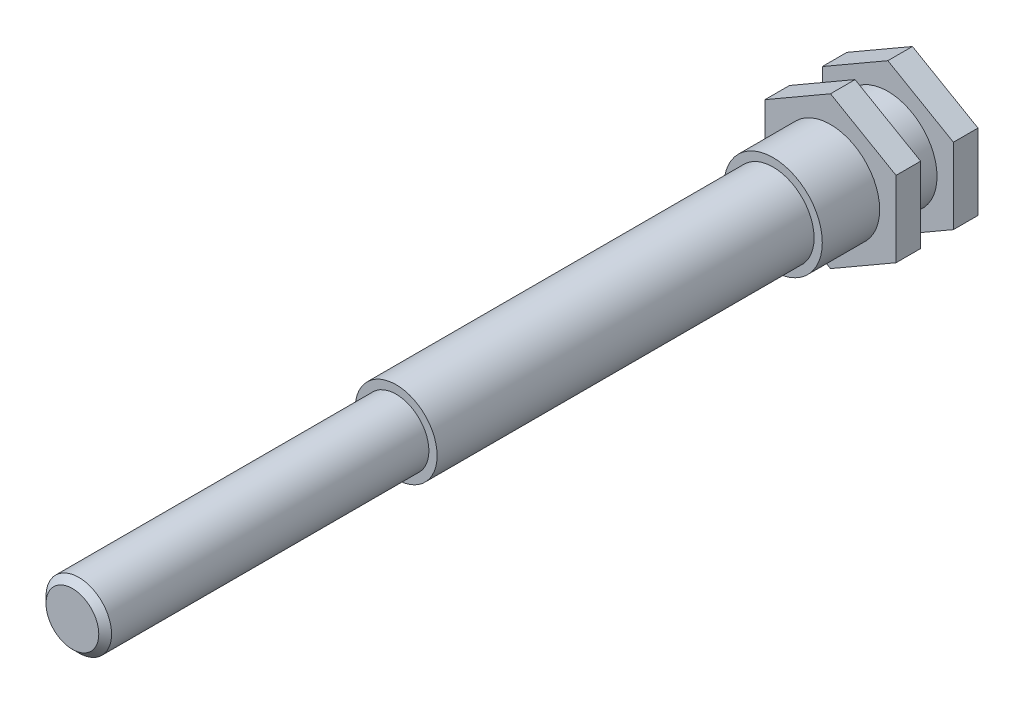
ISO-10303-21;
HEADER;
FILE_DESCRIPTION(('STEP AP214'),'2;1');
FILE_NAME('part.step','',(''),(''),'','','');
FILE_SCHEMA(('AUTOMOTIVE_DESIGN { 1 0 10303 214 1 1 1 1 }'));
ENDSEC;
DATA;
#1=APPLICATION_CONTEXT('core data for automotive mechanical design processes');
#2=APPLICATION_PROTOCOL_DEFINITION('international standard','automotive_design',2000,#1);
#3=PRODUCT_CONTEXT('',#1,'mechanical');
#4=PRODUCT('Part','Part','',(#3));
#5=PRODUCT_RELATED_PRODUCT_CATEGORY('part','',(#4));
#6=PRODUCT_DEFINITION_FORMATION('','',#4);
#7=PRODUCT_DEFINITION_CONTEXT('part definition',#1,'design');
#8=PRODUCT_DEFINITION('design','',#6,#7);
#9=PRODUCT_DEFINITION_SHAPE('','',#8);
#10=(LENGTH_UNIT() NAMED_UNIT(*) SI_UNIT(.MILLI.,.METRE.));
#11=(NAMED_UNIT(*) PLANE_ANGLE_UNIT() SI_UNIT($,.RADIAN.));
#12=(NAMED_UNIT(*) SI_UNIT($,.STERADIAN.) SOLID_ANGLE_UNIT());
#13=UNCERTAINTY_MEASURE_WITH_UNIT(LENGTH_MEASURE(1.E-05),#10,'distance_accuracy_value','');
#14=(GEOMETRIC_REPRESENTATION_CONTEXT(3) GLOBAL_UNCERTAINTY_ASSIGNED_CONTEXT((#13)) GLOBAL_UNIT_ASSIGNED_CONTEXT((#10,
#11,#12)) REPRESENTATION_CONTEXT('',''));
#15=CARTESIAN_POINT('',(0.,0.,0.));
#16=DIRECTION('',(0.,0.,1.));
#17=DIRECTION('',(1.,0.,0.));
#18=AXIS2_PLACEMENT_3D('',#15,#16,#17);
#19=CARTESIAN_POINT('',(0.,0.,31.5));
#20=DIRECTION('',(0.,0.,1.));
#21=DIRECTION('',(1.,0.,0.));
#22=AXIS2_PLACEMENT_3D('',#19,#20,#21);
#23=PLANE('',#22);
#24=CARTESIAN_POINT('',(0.,0.,31.5));
#25=DIRECTION('',(0.,0.,1.));
#26=DIRECTION('',(1.,0.,0.));
#27=AXIS2_PLACEMENT_3D('',#24,#25,#26);
#28=CIRCLE('',#27,2.5);
#29=CARTESIAN_POINT('',(2.5,0.,31.5));
#30=VERTEX_POINT('',#29);
#31=EDGE_CURVE('E306',#30,#30,#28,.T.);
#32=ORIENTED_EDGE('',*,*,#31,.T.);
#33=EDGE_LOOP('',(#32));
#34=FACE_BOUND('',#33,.T.);
#35=CARTESIAN_POINT('',(0.,0.,31.5));
#36=DIRECTION('',(0.,0.,1.));
#37=DIRECTION('',(1.,0.,0.));
#38=AXIS2_PLACEMENT_3D('',#35,#36,#37);
#39=CIRCLE('',#38,2.);
#40=CARTESIAN_POINT('',(2.,0.,31.5));
#41=VERTEX_POINT('',#40);
#42=EDGE_CURVE('E326',#41,#41,#39,.T.);
#43=ORIENTED_EDGE('',*,*,#42,.F.);
#44=EDGE_LOOP('',(#43));
#45=FACE_BOUND('',#44,.T.);
#46=ADVANCED_FACE('F49',(#34,#45),#23,.T.);
#47=CARTESIAN_POINT('',(0.,0.,8.5));
#48=DIRECTION('',(0.,0.,1.));
#49=DIRECTION('',(1.,0.,0.));
#50=AXIS2_PLACEMENT_3D('',#47,#48,#49);
#51=PLANE('',#50);
#52=CARTESIAN_POINT('',(0.,0.,8.5));
#53=DIRECTION('',(0.,0.,1.));
#54=DIRECTION('',(1.,0.,0.));
#55=AXIS2_PLACEMENT_3D('',#52,#53,#54);
#56=CIRCLE('',#55,3.);
#57=CARTESIAN_POINT('',(3.,0.,8.5));
#58=VERTEX_POINT('',#57);
#59=EDGE_CURVE('E144',#58,#58,#56,.T.);
#60=ORIENTED_EDGE('',*,*,#59,.T.);
#61=EDGE_LOOP('',(#60));
#62=FACE_BOUND('',#61,.T.);
#63=CARTESIAN_POINT('',(0.,0.,8.5));
#64=DIRECTION('',(0.,0.,1.));
#65=DIRECTION('',(1.,0.,0.));
#66=AXIS2_PLACEMENT_3D('',#63,#64,#65);
#67=CIRCLE('',#66,2.5);
#68=CARTESIAN_POINT('',(2.5,0.,8.5));
#69=VERTEX_POINT('',#68);
#70=EDGE_CURVE('E323',#69,#69,#67,.T.);
#71=ORIENTED_EDGE('',*,*,#70,.F.);
#72=EDGE_LOOP('',(#71));
#73=FACE_BOUND('',#72,.T.);
#74=ADVANCED_FACE('F181',(#62,#73),#51,.T.);
#75=CARTESIAN_POINT('',(0.,0.,8.5));
#76=DIRECTION('',(0.,0.,-1.));
#77=DIRECTION('',(-1.,0.,0.));
#78=AXIS2_PLACEMENT_3D('',#75,#76,#77);
#79=CYLINDRICAL_SURFACE('',#78,3.);
#80=CARTESIAN_POINT('',(0.,0.,1.5));
#81=DIRECTION('',(0.,0.,1.));
#82=DIRECTION('',(1.,0.,0.));
#83=AXIS2_PLACEMENT_3D('',#80,#81,#82);
#84=CIRCLE('',#83,3.);
#85=CARTESIAN_POINT('',(3.,0.,1.5));
#86=VERTEX_POINT('',#85);
#87=EDGE_CURVE('E165',#86,#86,#84,.T.);
#88=ORIENTED_EDGE('',*,*,#87,.T.);
#89=EDGE_LOOP('',(#88));
#90=FACE_BOUND('',#89,.T.);
#91=CARTESIAN_POINT('',(0.,0.,3.5));
#92=DIRECTION('',(0.,0.,1.));
#93=DIRECTION('',(1.,0.,0.));
#94=AXIS2_PLACEMENT_3D('',#91,#92,#93);
#95=CIRCLE('',#94,3.);
#96=CARTESIAN_POINT('',(3.,0.,3.5));
#97=VERTEX_POINT('',#96);
#98=EDGE_CURVE('E160',#97,#97,#95,.T.);
#99=ORIENTED_EDGE('',*,*,#98,.F.);
#100=EDGE_LOOP('',(#99));
#101=FACE_BOUND('',#100,.T.);
#102=ADVANCED_FACE('F187',(#90,#101),#79,.T.);
#103=CARTESIAN_POINT('',(0.,0.,1.5));
#104=DIRECTION('',(0.,0.,1.));
#105=DIRECTION('',(1.,0.,0.));
#106=AXIS2_PLACEMENT_3D('',#103,#104,#105);
#107=PLANE('',#106);
#108=DIRECTION('',(-0.86602540378444,-0.500000000000001,0.));
#109=VECTOR('',#108,1.);
#110=CARTESIAN_POINT('',(0.,4.61880215351702,1.5));
#111=LINE('',#110,#109);
#112=CARTESIAN_POINT('',(0.,4.61880215351702,1.5));
#113=VERTEX_POINT('',#112);
#114=CARTESIAN_POINT('',(-4.,2.3094010767585,1.5));
#115=VERTEX_POINT('',#114);
#116=EDGE_CURVE('E151',#113,#115,#111,.T.);
#117=ORIENTED_EDGE('',*,*,#116,.T.);
#118=DIRECTION('',(0.,-1.,0.));
#119=VECTOR('',#118,1.);
#120=CARTESIAN_POINT('',(-4.,2.3094010767585,1.5));
#121=LINE('',#120,#119);
#122=CARTESIAN_POINT('',(-4.00000000000001,-2.30940107675851,1.5));
#123=VERTEX_POINT('',#122);
#124=EDGE_CURVE('E105',#115,#123,#121,.T.);
#125=ORIENTED_EDGE('',*,*,#124,.T.);
#126=DIRECTION('',(0.86602540378444,-0.5,0.));
#127=VECTOR('',#126,1.);
#128=CARTESIAN_POINT('',(-4.00000000000001,-2.30940107675851,1.5));
#129=LINE('',#128,#127);
#130=CARTESIAN_POINT('',(0.,-4.61880215351701,1.5));
#131=VERTEX_POINT('',#130);
#132=EDGE_CURVE('E122',#123,#131,#129,.T.);
#133=ORIENTED_EDGE('',*,*,#132,.T.);
#134=DIRECTION('',(0.86602540378444,0.500000000000001,0.));
#135=VECTOR('',#134,1.);
#136=CARTESIAN_POINT('',(0.,-4.61880215351701,1.5));
#137=LINE('',#136,#135);
#138=CARTESIAN_POINT('',(4.,-2.30940107675851,1.5));
#139=VERTEX_POINT('',#138);
#140=EDGE_CURVE('E115',#131,#139,#137,.T.);
#141=ORIENTED_EDGE('',*,*,#140,.T.);
#142=DIRECTION('',(0.,1.,0.));
#143=VECTOR('',#142,1.);
#144=CARTESIAN_POINT('',(4.,-2.30940107675851,1.5));
#145=LINE('',#144,#143);
#146=CARTESIAN_POINT('',(4.,2.3094010767585,1.5));
#147=VERTEX_POINT('',#146);
#148=EDGE_CURVE('E120',#139,#147,#145,.T.);
#149=ORIENTED_EDGE('',*,*,#148,.T.);
#150=DIRECTION('',(-0.86602540378444,0.5,0.));
#151=VECTOR('',#150,1.);
#152=CARTESIAN_POINT('',(4.,2.3094010767585,1.5));
#153=LINE('',#152,#151);
#154=EDGE_CURVE('E66',#147,#113,#153,.T.);
#155=ORIENTED_EDGE('',*,*,#154,.T.);
#156=EDGE_LOOP('',(#117,#125,#133,#141,#149,#155));
#157=FACE_BOUND('',#156,.T.);
#158=ORIENTED_EDGE('',*,*,#87,.F.);
#159=EDGE_LOOP('',(#158));
#160=FACE_BOUND('',#159,.T.);
#161=ADVANCED_FACE('F117',(#157,#160),#107,.T.);
#162=CARTESIAN_POINT('',(0.,4.61880215351702,1.5));
#163=DIRECTION('',(0.500000000000001,-0.866025403784439,0.));
#164=DIRECTION('',(0.866025403784439,0.500000000000001,0.));
#165=AXIS2_PLACEMENT_3D('',#162,#163,#164);
#166=PLANE('',#165);
#167=DIRECTION('',(-0.86602540378444,-0.500000000000001,0.));
#168=VECTOR('',#167,1.);
#169=CARTESIAN_POINT('',(0.,4.61880215351702,0.));
#170=LINE('',#169,#168);
#171=CARTESIAN_POINT('',(0.,4.61880215351702,0.));
#172=VERTEX_POINT('',#171);
#173=CARTESIAN_POINT('',(-4.,2.3094010767585,0.));
#174=VERTEX_POINT('',#173);
#175=EDGE_CURVE('E140',#172,#174,#170,.T.);
#176=ORIENTED_EDGE('',*,*,#175,.T.);
#177=DIRECTION('',(0.,0.,-1.));
#178=VECTOR('',#177,1.);
#179=CARTESIAN_POINT('',(-4.,2.3094010767585,1.5));
#180=LINE('',#179,#178);
#181=EDGE_CURVE('E158',#115,#174,#180,.T.);
#182=ORIENTED_EDGE('',*,*,#181,.F.);
#183=ORIENTED_EDGE('',*,*,#116,.F.);
#184=DIRECTION('',(0.,0.,-1.));
#185=VECTOR('',#184,1.);
#186=CARTESIAN_POINT('',(0.,4.61880215351702,1.5));
#187=LINE('',#186,#185);
#188=EDGE_CURVE('E136',#113,#172,#187,.T.);
#189=ORIENTED_EDGE('',*,*,#188,.T.);
#190=EDGE_LOOP('',(#176,#182,#183,#189));
#191=FACE_BOUND('',#190,.T.);
#192=ADVANCED_FACE('F237',(#191),#166,.F.);
#193=CARTESIAN_POINT('',(-4.,2.3094010767585,1.5));
#194=DIRECTION('',(1.,0.,0.));
#195=DIRECTION('',(0.,0.,-1.));
#196=AXIS2_PLACEMENT_3D('',#193,#194,#195);
#197=PLANE('',#196);
#198=DIRECTION('',(0.,-1.,0.));
#199=VECTOR('',#198,1.);
#200=CARTESIAN_POINT('',(-4.,2.3094010767585,0.));
#201=LINE('',#200,#199);
#202=CARTESIAN_POINT('',(-4.00000000000001,-2.30940107675851,0.));
#203=VERTEX_POINT('',#202);
#204=EDGE_CURVE('E143',#174,#203,#201,.T.);
#205=ORIENTED_EDGE('',*,*,#204,.T.);
#206=DIRECTION('',(0.,0.,-1.));
#207=VECTOR('',#206,1.);
#208=CARTESIAN_POINT('',(-4.00000000000001,-2.30940107675851,1.5));
#209=LINE('',#208,#207);
#210=EDGE_CURVE('E155',#123,#203,#209,.T.);
#211=ORIENTED_EDGE('',*,*,#210,.F.);
#212=ORIENTED_EDGE('',*,*,#124,.F.);
#213=ORIENTED_EDGE('',*,*,#181,.T.);
#214=EDGE_LOOP('',(#205,#211,#212,#213));
#215=FACE_BOUND('',#214,.T.);
#216=ADVANCED_FACE('F251',(#215),#197,.F.);
#217=CARTESIAN_POINT('',(-4.00000000000001,-2.30940107675851,1.5));
#218=DIRECTION('',(0.5,0.86602540378444,0.));
#219=DIRECTION('',(-0.86602540378444,0.5,0.));
#220=AXIS2_PLACEMENT_3D('',#217,#218,#219);
#221=PLANE('',#220);
#222=DIRECTION('',(0.86602540378444,-0.5,0.));
#223=VECTOR('',#222,1.);
#224=CARTESIAN_POINT('',(-4.00000000000001,-2.30940107675851,0.));
#225=LINE('',#224,#223);
#226=CARTESIAN_POINT('',(0.,-4.61880215351701,0.));
#227=VERTEX_POINT('',#226);
#228=EDGE_CURVE('E146',#203,#227,#225,.T.);
#229=ORIENTED_EDGE('',*,*,#228,.T.);
#230=DIRECTION('',(0.,0.,-1.));
#231=VECTOR('',#230,1.);
#232=CARTESIAN_POINT('',(0.,-4.61880215351701,1.5));
#233=LINE('',#232,#231);
#234=EDGE_CURVE('E131',#131,#227,#233,.T.);
#235=ORIENTED_EDGE('',*,*,#234,.F.);
#236=ORIENTED_EDGE('',*,*,#132,.F.);
#237=ORIENTED_EDGE('',*,*,#210,.T.);
#238=EDGE_LOOP('',(#229,#235,#236,#237));
#239=FACE_BOUND('',#238,.T.);
#240=ADVANCED_FACE('F248',(#239),#221,.F.);
#241=CARTESIAN_POINT('',(0.,-4.61880215351701,1.5));
#242=DIRECTION('',(-0.500000000000001,0.86602540378444,0.));
#243=DIRECTION('',(-0.86602540378444,-0.500000000000001,0.));
#244=AXIS2_PLACEMENT_3D('',#241,#242,#243);
#245=PLANE('',#244);
#246=DIRECTION('',(0.86602540378444,0.500000000000001,0.));
#247=VECTOR('',#246,1.);
#248=CARTESIAN_POINT('',(0.,-4.61880215351701,0.));
#249=LINE('',#248,#247);
#250=CARTESIAN_POINT('',(4.,-2.30940107675851,0.));
#251=VERTEX_POINT('',#250);
#252=EDGE_CURVE('E130',#227,#251,#249,.T.);
#253=ORIENTED_EDGE('',*,*,#252,.T.);
#254=DIRECTION('',(0.,0.,-1.));
#255=VECTOR('',#254,1.);
#256=CARTESIAN_POINT('',(4.,-2.30940107675851,1.5));
#257=LINE('',#256,#255);
#258=EDGE_CURVE('E127',#139,#251,#257,.T.);
#259=ORIENTED_EDGE('',*,*,#258,.F.);
#260=ORIENTED_EDGE('',*,*,#140,.F.);
#261=ORIENTED_EDGE('',*,*,#234,.T.);
#262=EDGE_LOOP('',(#253,#259,#260,#261));
#263=FACE_BOUND('',#262,.T.);
#264=ADVANCED_FACE('F128',(#263),#245,.F.);
#265=CARTESIAN_POINT('',(4.,-2.30940107675851,1.5));
#266=DIRECTION('',(-1.,0.,0.));
#267=DIRECTION('',(0.,-1.,0.));
#268=AXIS2_PLACEMENT_3D('',#265,#266,#267);
#269=PLANE('',#268);
#270=DIRECTION('',(0.,1.,0.));
#271=VECTOR('',#270,1.);
#272=CARTESIAN_POINT('',(4.,-2.30940107675851,0.));
#273=LINE('',#272,#271);
#274=CARTESIAN_POINT('',(4.,2.3094010767585,0.));
#275=VERTEX_POINT('',#274);
#276=EDGE_CURVE('E90',#251,#275,#273,.T.);
#277=ORIENTED_EDGE('',*,*,#276,.T.);
#278=DIRECTION('',(0.,0.,-1.));
#279=VECTOR('',#278,1.);
#280=CARTESIAN_POINT('',(4.,2.3094010767585,1.5));
#281=LINE('',#280,#279);
#282=EDGE_CURVE('E132',#147,#275,#281,.T.);
#283=ORIENTED_EDGE('',*,*,#282,.F.);
#284=ORIENTED_EDGE('',*,*,#148,.F.);
#285=ORIENTED_EDGE('',*,*,#258,.T.);
#286=EDGE_LOOP('',(#277,#283,#284,#285));
#287=FACE_BOUND('',#286,.T.);
#288=ADVANCED_FACE('F134',(#287),#269,.F.);
#289=CARTESIAN_POINT('',(4.,2.3094010767585,1.5));
#290=DIRECTION('',(-0.500000000000001,-0.86602540378444,0.));
#291=DIRECTION('',(0.86602540378444,-0.500000000000001,0.));
#292=AXIS2_PLACEMENT_3D('',#289,#290,#291);
#293=PLANE('',#292);
#294=DIRECTION('',(-0.86602540378444,0.5,0.));
#295=VECTOR('',#294,1.);
#296=CARTESIAN_POINT('',(4.,2.3094010767585,0.));
#297=LINE('',#296,#295);
#298=EDGE_CURVE('E96',#275,#172,#297,.T.);
#299=ORIENTED_EDGE('',*,*,#298,.T.);
#300=ORIENTED_EDGE('',*,*,#188,.F.);
#301=ORIENTED_EDGE('',*,*,#154,.F.);
#302=ORIENTED_EDGE('',*,*,#282,.T.);
#303=EDGE_LOOP('',(#299,#300,#301,#302));
#304=FACE_BOUND('',#303,.T.);
#305=ADVANCED_FACE('F240',(#304),#293,.F.);
#306=CARTESIAN_POINT('',(0.,0.,0.));
#307=DIRECTION('',(0.,0.,1.));
#308=DIRECTION('',(1.,0.,0.));
#309=AXIS2_PLACEMENT_3D('',#306,#307,#308);
#310=PLANE('',#309);
#311=ORIENTED_EDGE('',*,*,#175,.F.);
#312=ORIENTED_EDGE('',*,*,#298,.F.);
#313=ORIENTED_EDGE('',*,*,#276,.F.);
#314=ORIENTED_EDGE('',*,*,#252,.F.);
#315=ORIENTED_EDGE('',*,*,#228,.F.);
#316=ORIENTED_EDGE('',*,*,#204,.F.);
#317=EDGE_LOOP('',(#311,#312,#313,#314,#315,#316));
#318=FACE_BOUND('',#317,.T.);
#319=ADVANCED_FACE('F203',(#318),#310,.F.);
#320=CARTESIAN_POINT('',(0.,0.,5.));
#321=DIRECTION('',(0.,0.,1.));
#322=DIRECTION('',(1.,0.,0.));
#323=AXIS2_PLACEMENT_3D('',#320,#321,#322);
#324=PLANE('',#323);
#325=DIRECTION('',(-0.86602540378444,-0.500000000000001,0.));
#326=VECTOR('',#325,1.);
#327=CARTESIAN_POINT('',(0.,4.61880215351702,5.));
#328=LINE('',#327,#326);
#329=CARTESIAN_POINT('',(0.,4.61880215351702,5.));
#330=VERTEX_POINT('',#329);
#331=CARTESIAN_POINT('',(-4.00000000000001,2.30940107675851,5.));
#332=VERTEX_POINT('',#331);
#333=EDGE_CURVE('E290',#330,#332,#328,.T.);
#334=ORIENTED_EDGE('',*,*,#333,.T.);
#335=DIRECTION('',(0.,-1.,0.));
#336=VECTOR('',#335,1.);
#337=CARTESIAN_POINT('',(-4.00000000000001,2.30940107675851,5.));
#338=LINE('',#337,#336);
#339=CARTESIAN_POINT('',(-4.00000000000001,-2.30940107675851,5.));
#340=VERTEX_POINT('',#339);
#341=EDGE_CURVE('E318',#332,#340,#338,.T.);
#342=ORIENTED_EDGE('',*,*,#341,.T.);
#343=DIRECTION('',(0.86602540378444,-0.5,0.));
#344=VECTOR('',#343,1.);
#345=CARTESIAN_POINT('',(-4.00000000000001,-2.30940107675851,5.));
#346=LINE('',#345,#344);
#347=CARTESIAN_POINT('',(0.,-4.61880215351701,5.));
#348=VERTEX_POINT('',#347);
#349=EDGE_CURVE('E315',#340,#348,#346,.T.);
#350=ORIENTED_EDGE('',*,*,#349,.T.);
#351=DIRECTION('',(0.86602540378444,0.500000000000001,0.));
#352=VECTOR('',#351,1.);
#353=CARTESIAN_POINT('',(0.,-4.61880215351701,5.));
#354=LINE('',#353,#352);
#355=CARTESIAN_POINT('',(4.,-2.3094010767585,5.));
#356=VERTEX_POINT('',#355);
#357=EDGE_CURVE('E312',#348,#356,#354,.T.);
#358=ORIENTED_EDGE('',*,*,#357,.T.);
#359=DIRECTION('',(0.,1.,0.));
#360=VECTOR('',#359,1.);
#361=CARTESIAN_POINT('',(4.,-2.3094010767585,5.));
#362=LINE('',#361,#360);
#363=CARTESIAN_POINT('',(4.,2.3094010767585,5.));
#364=VERTEX_POINT('',#363);
#365=EDGE_CURVE('E309',#356,#364,#362,.T.);
#366=ORIENTED_EDGE('',*,*,#365,.T.);
#367=DIRECTION('',(-0.86602540378444,0.5,0.));
#368=VECTOR('',#367,1.);
#369=CARTESIAN_POINT('',(4.,2.3094010767585,5.));
#370=LINE('',#369,#368);
#371=EDGE_CURVE('E286',#364,#330,#370,.T.);
#372=ORIENTED_EDGE('',*,*,#371,.T.);
#373=EDGE_LOOP('',(#334,#342,#350,#358,#366,#372));
#374=FACE_BOUND('',#373,.T.);
#375=CARTESIAN_POINT('',(0.,0.,5.));
#376=DIRECTION('',(0.,0.,1.));
#377=DIRECTION('',(1.,0.,0.));
#378=AXIS2_PLACEMENT_3D('',#375,#376,#377);
#379=CIRCLE('',#378,3.);
#380=CARTESIAN_POINT('',(3.,0.,5.));
#381=VERTEX_POINT('',#380);
#382=EDGE_CURVE('E163',#381,#381,#379,.T.);
#383=ORIENTED_EDGE('',*,*,#382,.F.);
#384=EDGE_LOOP('',(#383));
#385=FACE_BOUND('',#384,.T.);
#386=ADVANCED_FACE('F199',(#374,#385),#324,.T.);
#387=CARTESIAN_POINT('',(0.,0.,3.5));
#388=DIRECTION('',(0.,0.,1.));
#389=DIRECTION('',(1.,0.,0.));
#390=AXIS2_PLACEMENT_3D('',#387,#388,#389);
#391=PLANE('',#390);
#392=DIRECTION('',(-0.86602540378444,-0.500000000000001,0.));
#393=VECTOR('',#392,1.);
#394=CARTESIAN_POINT('',(0.,4.61880215351702,3.5));
#395=LINE('',#394,#393);
#396=CARTESIAN_POINT('',(0.,4.61880215351702,3.5));
#397=VERTEX_POINT('',#396);
#398=CARTESIAN_POINT('',(-4.00000000000001,2.30940107675851,3.5));
#399=VERTEX_POINT('',#398);
#400=EDGE_CURVE('E303',#397,#399,#395,.T.);
#401=ORIENTED_EDGE('',*,*,#400,.F.);
#402=DIRECTION('',(-0.86602540378444,0.5,0.));
#403=VECTOR('',#402,1.);
#404=CARTESIAN_POINT('',(4.,2.3094010767585,3.5));
#405=LINE('',#404,#403);
#406=CARTESIAN_POINT('',(4.,2.3094010767585,3.5));
#407=VERTEX_POINT('',#406);
#408=EDGE_CURVE('E287',#407,#397,#405,.T.);
#409=ORIENTED_EDGE('',*,*,#408,.F.);
#410=DIRECTION('',(0.,1.,0.));
#411=VECTOR('',#410,1.);
#412=CARTESIAN_POINT('',(4.,-2.3094010767585,3.5));
#413=LINE('',#412,#411);
#414=CARTESIAN_POINT('',(4.,-2.3094010767585,3.5));
#415=VERTEX_POINT('',#414);
#416=EDGE_CURVE('E291',#415,#407,#413,.T.);
#417=ORIENTED_EDGE('',*,*,#416,.F.);
#418=DIRECTION('',(0.86602540378444,0.500000000000001,0.));
#419=VECTOR('',#418,1.);
#420=CARTESIAN_POINT('',(0.,-4.61880215351701,3.5));
#421=LINE('',#420,#419);
#422=CARTESIAN_POINT('',(0.,-4.61880215351701,3.5));
#423=VERTEX_POINT('',#422);
#424=EDGE_CURVE('E294',#423,#415,#421,.T.);
#425=ORIENTED_EDGE('',*,*,#424,.F.);
#426=DIRECTION('',(0.86602540378444,-0.5,0.));
#427=VECTOR('',#426,1.);
#428=CARTESIAN_POINT('',(-4.00000000000001,-2.30940107675851,3.5));
#429=LINE('',#428,#427);
#430=CARTESIAN_POINT('',(-4.00000000000001,-2.30940107675851,3.5));
#431=VERTEX_POINT('',#430);
#432=EDGE_CURVE('E297',#431,#423,#429,.T.);
#433=ORIENTED_EDGE('',*,*,#432,.F.);
#434=DIRECTION('',(0.,-1.,0.));
#435=VECTOR('',#434,1.);
#436=CARTESIAN_POINT('',(-4.00000000000001,2.30940107675851,3.5));
#437=LINE('',#436,#435);
#438=EDGE_CURVE('E300',#399,#431,#437,.T.);
#439=ORIENTED_EDGE('',*,*,#438,.F.);
#440=EDGE_LOOP('',(#401,#409,#417,#425,#433,#439));
#441=FACE_BOUND('',#440,.T.);
#442=ORIENTED_EDGE('',*,*,#98,.T.);
#443=EDGE_LOOP('',(#442));
#444=FACE_BOUND('',#443,.T.);
#445=ADVANCED_FACE('F202',(#441,#444),#391,.F.);
#446=CARTESIAN_POINT('',(0.,4.61880215351702,5.));
#447=DIRECTION('',(0.500000000000001,-0.866025403784439,0.));
#448=DIRECTION('',(0.866025403784439,0.500000000000001,0.));
#449=AXIS2_PLACEMENT_3D('',#446,#447,#448);
#450=PLANE('',#449);
#451=ORIENTED_EDGE('',*,*,#400,.T.);
#452=DIRECTION('',(0.,0.,-1.));
#453=VECTOR('',#452,1.);
#454=CARTESIAN_POINT('',(-4.00000000000001,2.30940107675851,5.));
#455=LINE('',#454,#453);
#456=EDGE_CURVE('E166',#332,#399,#455,.T.);
#457=ORIENTED_EDGE('',*,*,#456,.F.);
#458=ORIENTED_EDGE('',*,*,#333,.F.);
#459=DIRECTION('',(0.,0.,-1.));
#460=VECTOR('',#459,1.);
#461=CARTESIAN_POINT('',(0.,4.61880215351702,5.));
#462=LINE('',#461,#460);
#463=EDGE_CURVE('E283',#330,#397,#462,.T.);
#464=ORIENTED_EDGE('',*,*,#463,.T.);
#465=EDGE_LOOP('',(#451,#457,#458,#464));
#466=FACE_BOUND('',#465,.T.);
#467=ADVANCED_FACE('F207',(#466),#450,.F.);
#468=CARTESIAN_POINT('',(-4.00000000000001,2.30940107675851,5.));
#469=DIRECTION('',(1.,0.,0.));
#470=DIRECTION('',(0.,0.,-1.));
#471=AXIS2_PLACEMENT_3D('',#468,#469,#470);
#472=PLANE('',#471);
#473=ORIENTED_EDGE('',*,*,#438,.T.);
#474=DIRECTION('',(0.,0.,-1.));
#475=VECTOR('',#474,1.);
#476=CARTESIAN_POINT('',(-4.00000000000001,-2.30940107675851,5.));
#477=LINE('',#476,#475);
#478=EDGE_CURVE('E271',#340,#431,#477,.T.);
#479=ORIENTED_EDGE('',*,*,#478,.F.);
#480=ORIENTED_EDGE('',*,*,#341,.F.);
#481=ORIENTED_EDGE('',*,*,#456,.T.);
#482=EDGE_LOOP('',(#473,#479,#480,#481));
#483=FACE_BOUND('',#482,.T.);
#484=ADVANCED_FACE('F224',(#483),#472,.F.);
#485=CARTESIAN_POINT('',(-4.00000000000001,-2.30940107675851,5.));
#486=DIRECTION('',(0.5,0.86602540378444,0.));
#487=DIRECTION('',(-0.86602540378444,0.5,0.));
#488=AXIS2_PLACEMENT_3D('',#485,#486,#487);
#489=PLANE('',#488);
#490=ORIENTED_EDGE('',*,*,#432,.T.);
#491=DIRECTION('',(0.,0.,-1.));
#492=VECTOR('',#491,1.);
#493=CARTESIAN_POINT('',(0.,-4.61880215351701,5.));
#494=LINE('',#493,#492);
#495=EDGE_CURVE('E274',#348,#423,#494,.T.);
#496=ORIENTED_EDGE('',*,*,#495,.F.);
#497=ORIENTED_EDGE('',*,*,#349,.F.);
#498=ORIENTED_EDGE('',*,*,#478,.T.);
#499=EDGE_LOOP('',(#490,#496,#497,#498));
#500=FACE_BOUND('',#499,.T.);
#501=ADVANCED_FACE('F220',(#500),#489,.F.);
#502=CARTESIAN_POINT('',(0.,-4.61880215351701,5.));
#503=DIRECTION('',(-0.500000000000001,0.86602540378444,0.));
#504=DIRECTION('',(-0.86602540378444,-0.500000000000001,0.));
#505=AXIS2_PLACEMENT_3D('',#502,#503,#504);
#506=PLANE('',#505);
#507=ORIENTED_EDGE('',*,*,#424,.T.);
#508=DIRECTION('',(0.,0.,-1.));
#509=VECTOR('',#508,1.);
#510=CARTESIAN_POINT('',(4.,-2.3094010767585,5.));
#511=LINE('',#510,#509);
#512=EDGE_CURVE('E277',#356,#415,#511,.T.);
#513=ORIENTED_EDGE('',*,*,#512,.F.);
#514=ORIENTED_EDGE('',*,*,#357,.F.);
#515=ORIENTED_EDGE('',*,*,#495,.T.);
#516=EDGE_LOOP('',(#507,#513,#514,#515));
#517=FACE_BOUND('',#516,.T.);
#518=ADVANCED_FACE('F216',(#517),#506,.F.);
#519=CARTESIAN_POINT('',(4.,-2.3094010767585,5.));
#520=DIRECTION('',(-1.,0.,0.));
#521=DIRECTION('',(0.,-1.,0.));
#522=AXIS2_PLACEMENT_3D('',#519,#520,#521);
#523=PLANE('',#522);
#524=ORIENTED_EDGE('',*,*,#416,.T.);
#525=DIRECTION('',(0.,0.,-1.));
#526=VECTOR('',#525,1.);
#527=CARTESIAN_POINT('',(4.,2.3094010767585,5.));
#528=LINE('',#527,#526);
#529=EDGE_CURVE('E280',#364,#407,#528,.T.);
#530=ORIENTED_EDGE('',*,*,#529,.F.);
#531=ORIENTED_EDGE('',*,*,#365,.F.);
#532=ORIENTED_EDGE('',*,*,#512,.T.);
#533=EDGE_LOOP('',(#524,#530,#531,#532));
#534=FACE_BOUND('',#533,.T.);
#535=ADVANCED_FACE('F212',(#534),#523,.F.);
#536=CARTESIAN_POINT('',(4.,2.3094010767585,5.));
#537=DIRECTION('',(-0.500000000000001,-0.86602540378444,0.));
#538=DIRECTION('',(0.86602540378444,-0.500000000000001,0.));
#539=AXIS2_PLACEMENT_3D('',#536,#537,#538);
#540=PLANE('',#539);
#541=ORIENTED_EDGE('',*,*,#408,.T.);
#542=ORIENTED_EDGE('',*,*,#463,.F.);
#543=ORIENTED_EDGE('',*,*,#371,.F.);
#544=ORIENTED_EDGE('',*,*,#529,.T.);
#545=EDGE_LOOP('',(#541,#542,#543,#544));
#546=FACE_BOUND('',#545,.T.);
#547=ADVANCED_FACE('F209',(#546),#540,.F.);
#548=ORIENTED_EDGE('',*,*,#382,.T.);
#549=EDGE_LOOP('',(#548));
#550=FACE_BOUND('',#549,.T.);
#551=ORIENTED_EDGE('',*,*,#59,.F.);
#552=EDGE_LOOP('',(#551));
#553=FACE_BOUND('',#552,.T.);
#554=ADVANCED_FACE('F197',(#550,#553),#79,.T.);
#555=CARTESIAN_POINT('',(0.,0.,31.5));
#556=DIRECTION('',(0.,0.,-1.));
#557=DIRECTION('',(-1.,0.,0.));
#558=AXIS2_PLACEMENT_3D('',#555,#556,#557);
#559=CYLINDRICAL_SURFACE('',#558,2.5);
#560=ORIENTED_EDGE('',*,*,#31,.F.);
#561=EDGE_LOOP('',(#560));
#562=FACE_BOUND('',#561,.T.);
#563=ORIENTED_EDGE('',*,*,#70,.T.);
#564=EDGE_LOOP('',(#563));
#565=FACE_BOUND('',#564,.T.);
#566=ADVANCED_FACE('F194',(#562,#565),#559,.T.);
#567=CARTESIAN_POINT('',(0.,0.,51.25));
#568=DIRECTION('',(0.,0.,-1.));
#569=DIRECTION('',(-1.,0.,0.));
#570=AXIS2_PLACEMENT_3D('',#567,#568,#569);
#571=CYLINDRICAL_SURFACE('',#570,2.);
#572=CARTESIAN_POINT('',(0.,0.,50.86));
#573=DIRECTION('',(0.,0.,1.));
#574=DIRECTION('',(1.,0.,0.));
#575=AXIS2_PLACEMENT_3D('',#572,#573,#574);
#576=CIRCLE('',#575,2.);
#577=CARTESIAN_POINT('',(2.,0.,50.86));
#578=VERTEX_POINT('',#577);
#579=EDGE_CURVE('E13',#578,#578,#576,.F.);
#580=ORIENTED_EDGE('',*,*,#579,.T.);
#581=EDGE_LOOP('',(#580));
#582=FACE_BOUND('',#581,.T.);
#583=ORIENTED_EDGE('',*,*,#42,.T.);
#584=EDGE_LOOP('',(#583));
#585=FACE_BOUND('',#584,.T.);
#586=ADVANCED_FACE('F177',(#582,#585),#571,.T.);
#587=CARTESIAN_POINT('',(0.,0.,51.25));
#588=DIRECTION('',(0.,0.,1.));
#589=DIRECTION('',(1.,0.,0.));
#590=AXIS2_PLACEMENT_3D('',#587,#588,#589);
#591=PLANE('',#590);
#592=CARTESIAN_POINT('',(0.,0.,51.25));
#593=DIRECTION('',(0.,0.,1.));
#594=DIRECTION('',(1.,0.,0.));
#595=AXIS2_PLACEMENT_3D('',#592,#593,#594);
#596=CIRCLE('',#595,1.61);
#597=CARTESIAN_POINT('',(1.61,0.,51.25));
#598=VERTEX_POINT('',#597);
#599=EDGE_CURVE('E58',#598,#598,#596,.T.);
#600=ORIENTED_EDGE('',*,*,#599,.T.);
#601=EDGE_LOOP('',(#600));
#602=FACE_BOUND('',#601,.T.);
#603=ADVANCED_FACE('F170',(#602),#591,.T.);
#604=CARTESIAN_POINT('',(0.,0.,51.25));
#605=DIRECTION('',(0.,0.,-1.));
#606=DIRECTION('',(-1.,0.,0.));
#607=AXIS2_PLACEMENT_3D('',#604,#605,#606);
#608=CONICAL_SURFACE('',#607,1.61,0.785398163397446);
#609=ORIENTED_EDGE('',*,*,#579,.F.);
#610=EDGE_LOOP('',(#609));
#611=FACE_BOUND('',#610,.T.);
#612=ORIENTED_EDGE('',*,*,#599,.F.);
#613=EDGE_LOOP('',(#612));
#614=FACE_BOUND('',#613,.T.);
#615=ADVANCED_FACE('F51',(#611,#614),#608,.T.);
#616=CLOSED_SHELL('',(#46,#74,#102,#161,#192,#216,#240,#264,#288,#305,#319,#386,#445,#467,#484,
#501,#518,#535,#547,#554,#566,#586,#603,#615));
#617=MANIFOLD_SOLID_BREP('B2',#616);
#618=ADVANCED_BREP_SHAPE_REPRESENTATION('',(#18,#617),#14);
#619=SHAPE_DEFINITION_REPRESENTATION(#9,#618);
ENDSEC;
END-ISO-10303-21;
